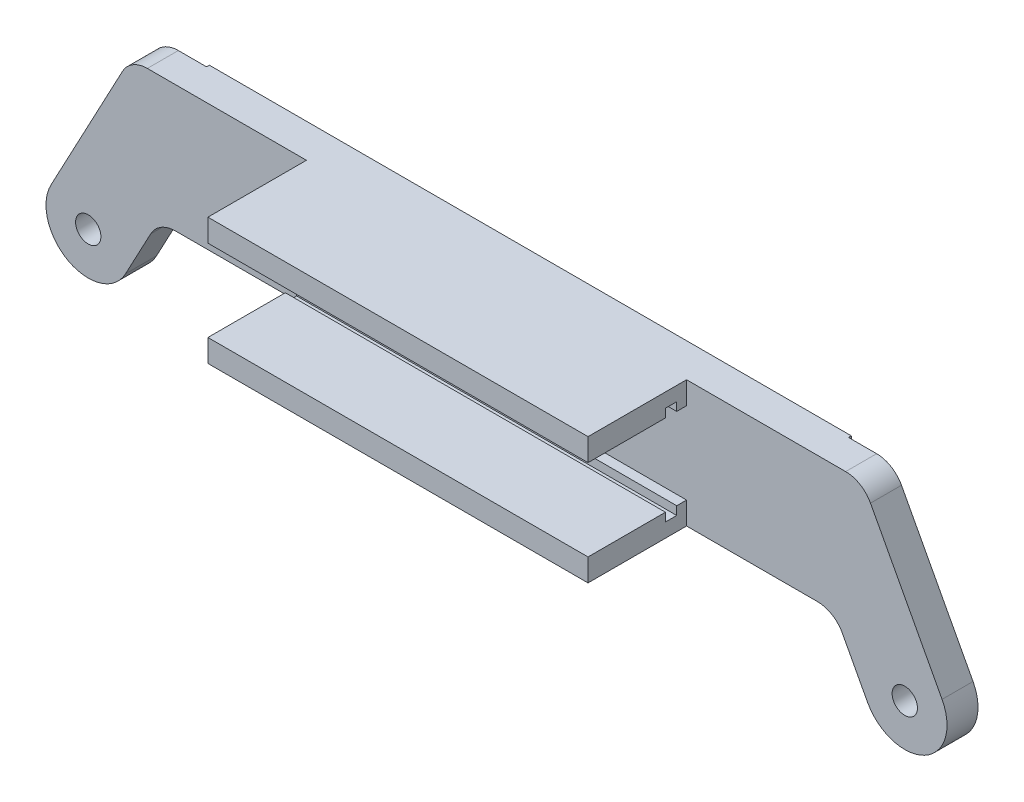
ISO-10303-21;
HEADER;
FILE_DESCRIPTION(('STEP AP214'),'2;1');
FILE_NAME('part.step','',(''),(''),'','','');
FILE_SCHEMA(('AUTOMOTIVE_DESIGN { 1 0 10303 214 1 1 1 1 }'));
ENDSEC;
DATA;
#1=APPLICATION_CONTEXT('core data for automotive mechanical design processes');
#2=APPLICATION_PROTOCOL_DEFINITION('international standard','automotive_design',2000,#1);
#3=PRODUCT_CONTEXT('',#1,'mechanical');
#4=PRODUCT('Part','Part','',(#3));
#5=PRODUCT_RELATED_PRODUCT_CATEGORY('part','',(#4));
#6=PRODUCT_DEFINITION_FORMATION('','',#4);
#7=PRODUCT_DEFINITION_CONTEXT('part definition',#1,'design');
#8=PRODUCT_DEFINITION('design','',#6,#7);
#9=PRODUCT_DEFINITION_SHAPE('','',#8);
#10=(LENGTH_UNIT() NAMED_UNIT(*) SI_UNIT(.MILLI.,.METRE.));
#11=(NAMED_UNIT(*) PLANE_ANGLE_UNIT() SI_UNIT($,.RADIAN.));
#12=(NAMED_UNIT(*) SI_UNIT($,.STERADIAN.) SOLID_ANGLE_UNIT());
#13=UNCERTAINTY_MEASURE_WITH_UNIT(LENGTH_MEASURE(1.E-05),#10,'distance_accuracy_value','');
#14=(GEOMETRIC_REPRESENTATION_CONTEXT(3) GLOBAL_UNCERTAINTY_ASSIGNED_CONTEXT((#13)) GLOBAL_UNIT_ASSIGNED_CONTEXT((#10,
#11,#12)) REPRESENTATION_CONTEXT('',''));
#15=CARTESIAN_POINT('',(0.,0.,0.));
#16=DIRECTION('',(0.,0.,1.));
#17=DIRECTION('',(1.,0.,0.));
#18=AXIS2_PLACEMENT_3D('',#15,#16,#17);
#19=CARTESIAN_POINT('',(0.,0.,-5.));
#20=DIRECTION('',(0.,0.,-1.));
#21=DIRECTION('',(-1.,0.,0.));
#22=AXIS2_PLACEMENT_3D('',#19,#20,#21);
#23=PLANE('',#22);
#24=DIRECTION('',(0.,-1.,0.));
#25=VECTOR('',#24,1.);
#26=CARTESIAN_POINT('',(114.,22.5,-5.));
#27=LINE('',#26,#25);
#28=CARTESIAN_POINT('',(114.,22.5,-5.));
#29=VERTEX_POINT('',#28);
#30=CARTESIAN_POINT('',(114.,-22.5,-5.));
#31=VERTEX_POINT('',#30);
#32=EDGE_CURVE('E60',#29,#31,#27,.T.);
#33=ORIENTED_EDGE('',*,*,#32,.F.);
#34=DIRECTION('',(1.,0.,0.));
#35=VECTOR('',#34,1.);
#36=CARTESIAN_POINT('',(-110.,22.5,-5.));
#37=LINE('',#36,#35);
#38=CARTESIAN_POINT('',(124.,22.5,-5.));
#39=VERTEX_POINT('',#38);
#40=EDGE_CURVE('E395',#29,#39,#37,.T.);
#41=ORIENTED_EDGE('',*,*,#40,.T.);
#42=CARTESIAN_POINT('',(124.,12.5,-5.));
#43=DIRECTION('',(0.,0.,-1.));
#44=DIRECTION('',(-1.,0.,0.));
#45=AXIS2_PLACEMENT_3D('',#42,#43,#44);
#46=CIRCLE('',#45,10.);
#47=CARTESIAN_POINT('',(132.823529411765,17.2058823529412,-5.));
#48=VERTEX_POINT('',#47);
#49=EDGE_CURVE('E457',#39,#48,#46,.T.);
#50=ORIENTED_EDGE('',*,*,#49,.T.);
#51=DIRECTION('',(0.470588235294117,-0.882352941176471,0.));
#52=VECTOR('',#51,1.);
#53=CARTESIAN_POINT('',(158.235294117647,-30.4411764705882,-5.));
#54=LINE('',#53,#52);
#55=CARTESIAN_POINT('',(158.235294117647,-30.4411764705882,-5.));
#56=VERTEX_POINT('',#55);
#57=EDGE_CURVE('E374',#48,#56,#54,.T.);
#58=ORIENTED_EDGE('',*,*,#57,.T.);
#59=CARTESIAN_POINT('',(145.,-37.5,-5.));
#60=DIRECTION('',(0.,0.,-1.));
#61=DIRECTION('',(-1.,0.,0.));
#62=AXIS2_PLACEMENT_3D('',#59,#60,#61);
#63=CIRCLE('',#62,15.);
#64=CARTESIAN_POINT('',(131.764705882353,-44.5588235294118,-5.));
#65=VERTEX_POINT('',#64);
#66=EDGE_CURVE('E388',#56,#65,#63,.T.);
#67=ORIENTED_EDGE('',*,*,#66,.T.);
#68=DIRECTION('',(-0.470588235294116,0.882352941176472,0.));
#69=VECTOR('',#68,1.);
#70=CARTESIAN_POINT('',(120.,-22.5,-5.));
#71=LINE('',#70,#69);
#72=CARTESIAN_POINT('',(122.823529411765,-27.7941176470588,-5.));
#73=VERTEX_POINT('',#72);
#74=EDGE_CURVE('E380',#65,#73,#71,.T.);
#75=ORIENTED_EDGE('',*,*,#74,.T.);
#76=CARTESIAN_POINT('',(114.,-32.5,-5.));
#77=DIRECTION('',(0.,0.,-1.));
#78=DIRECTION('',(-1.,0.,0.));
#79=AXIS2_PLACEMENT_3D('',#76,#77,#78);
#80=CIRCLE('',#79,10.);
#81=EDGE_CURVE('E479',#73,#31,#80,.F.);
#82=ORIENTED_EDGE('',*,*,#81,.T.);
#83=EDGE_LOOP('',(#33,#41,#50,#58,#67,#75,#82));
#84=FACE_BOUND('',#83,.T.);
#85=CARTESIAN_POINT('',(145.,-37.5,-5.));
#86=DIRECTION('',(0.,0.,1.));
#87=DIRECTION('',(1.,0.,0.));
#88=AXIS2_PLACEMENT_3D('',#85,#86,#87);
#89=CIRCLE('',#88,4.49999999999999);
#90=CARTESIAN_POINT('',(149.5,-37.5,-5.));
#91=VERTEX_POINT('',#90);
#92=EDGE_CURVE('E371',#91,#91,#89,.T.);
#93=ORIENTED_EDGE('',*,*,#92,.T.);
#94=EDGE_LOOP('',(#93));
#95=FACE_BOUND('',#94,.T.);
#96=ADVANCED_FACE('F45',(#84,#95),#23,.T.);
#97=CARTESIAN_POINT('',(-75.,-14.5,41.));
#98=DIRECTION('',(0.,-1.,0.));
#99=DIRECTION('',(0.,0.,-1.));
#100=AXIS2_PLACEMENT_3D('',#97,#98,#99);
#101=PLANE('',#100);
#102=DIRECTION('',(-1.,0.,0.));
#103=VECTOR('',#102,1.);
#104=CARTESIAN_POINT('',(-75.,-14.5,13.5));
#105=LINE('',#104,#103);
#106=CARTESIAN_POINT('',(67.5,-14.5,13.5));
#107=VERTEX_POINT('',#106);
#108=CARTESIAN_POINT('',(-67.5,-14.5,13.5));
#109=VERTEX_POINT('',#108);
#110=EDGE_CURVE('E445',#107,#109,#105,.T.);
#111=ORIENTED_EDGE('',*,*,#110,.T.);
#112=DIRECTION('',(0.,0.,1.));
#113=VECTOR('',#112,1.);
#114=CARTESIAN_POINT('',(-67.5,-14.5,6.));
#115=LINE('',#114,#113);
#116=CARTESIAN_POINT('',(-67.5,-14.5,41.));
#117=VERTEX_POINT('',#116);
#118=EDGE_CURVE('E272',#109,#117,#115,.T.);
#119=ORIENTED_EDGE('',*,*,#118,.T.);
#120=DIRECTION('',(-1.,0.,0.));
#121=VECTOR('',#120,1.);
#122=CARTESIAN_POINT('',(-77.5,-14.5,41.));
#123=LINE('',#122,#121);
#124=CARTESIAN_POINT('',(67.5,-14.5,41.));
#125=VERTEX_POINT('',#124);
#126=EDGE_CURVE('E432',#125,#117,#123,.T.);
#127=ORIENTED_EDGE('',*,*,#126,.F.);
#128=DIRECTION('',(0.,0.,1.));
#129=VECTOR('',#128,1.);
#130=CARTESIAN_POINT('',(67.5,-14.5,6.));
#131=LINE('',#130,#129);
#132=EDGE_CURVE('E296',#107,#125,#131,.T.);
#133=ORIENTED_EDGE('',*,*,#132,.F.);
#134=EDGE_LOOP('',(#111,#119,#127,#133));
#135=FACE_BOUND('',#134,.T.);
#136=ADVANCED_FACE('F560',(#135),#101,.F.);
#137=CARTESIAN_POINT('',(77.5,14.5,41.));
#138=DIRECTION('',(0.,1.,0.));
#139=DIRECTION('',(0.,0.,1.));
#140=AXIS2_PLACEMENT_3D('',#137,#138,#139);
#141=PLANE('',#140);
#142=DIRECTION('',(1.,0.,0.));
#143=VECTOR('',#142,1.);
#144=CARTESIAN_POINT('',(77.5,14.5,6.));
#145=LINE('',#144,#143);
#146=CARTESIAN_POINT('',(-67.5,14.5,6.));
#147=VERTEX_POINT('',#146);
#148=CARTESIAN_POINT('',(67.5,14.5,6.));
#149=VERTEX_POINT('',#148);
#150=EDGE_CURVE('E423',#147,#149,#145,.T.);
#151=ORIENTED_EDGE('',*,*,#150,.T.);
#152=DIRECTION('',(0.,0.,1.));
#153=VECTOR('',#152,1.);
#154=CARTESIAN_POINT('',(67.5,14.5,6.));
#155=LINE('',#154,#153);
#156=CARTESIAN_POINT('',(67.5,14.5,9.5));
#157=VERTEX_POINT('',#156);
#158=EDGE_CURVE('E284',#149,#157,#155,.T.);
#159=ORIENTED_EDGE('',*,*,#158,.T.);
#160=DIRECTION('',(-1.,0.,0.));
#161=VECTOR('',#160,1.);
#162=CARTESIAN_POINT('',(110.,14.5,9.5));
#163=LINE('',#162,#161);
#164=CARTESIAN_POINT('',(-67.5,14.5,9.5));
#165=VERTEX_POINT('',#164);
#166=EDGE_CURVE('E411',#157,#165,#163,.T.);
#167=ORIENTED_EDGE('',*,*,#166,.T.);
#168=DIRECTION('',(0.,0.,1.));
#169=VECTOR('',#168,1.);
#170=CARTESIAN_POINT('',(-67.5,14.5,6.));
#171=LINE('',#170,#169);
#172=EDGE_CURVE('E321',#147,#165,#171,.T.);
#173=ORIENTED_EDGE('',*,*,#172,.F.);
#174=EDGE_LOOP('',(#151,#159,#167,#173));
#175=FACE_BOUND('',#174,.T.);
#176=ADVANCED_FACE('F503',(#175),#141,.F.);
#177=CARTESIAN_POINT('',(110.,-22.5,6.));
#178=DIRECTION('',(0.,1.,0.));
#179=DIRECTION('',(-1.,0.,0.));
#180=AXIS2_PLACEMENT_3D('',#177,#178,#179);
#181=PLANE('',#180);
#182=DIRECTION('',(1.,0.,0.));
#183=VECTOR('',#182,1.);
#184=CARTESIAN_POINT('',(-77.5,-22.5,41.));
#185=LINE('',#184,#183);
#186=CARTESIAN_POINT('',(-67.5,-22.5,41.));
#187=VERTEX_POINT('',#186);
#188=CARTESIAN_POINT('',(67.5,-22.5,41.));
#189=VERTEX_POINT('',#188);
#190=EDGE_CURVE('E404',#187,#189,#185,.T.);
#191=ORIENTED_EDGE('',*,*,#190,.F.);
#192=DIRECTION('',(0.,0.,1.));
#193=VECTOR('',#192,1.);
#194=CARTESIAN_POINT('',(-67.5,-22.5,6.));
#195=LINE('',#194,#193);
#196=CARTESIAN_POINT('',(-67.5,-22.5,6.));
#197=VERTEX_POINT('',#196);
#198=EDGE_CURVE('E305',#197,#187,#195,.T.);
#199=ORIENTED_EDGE('',*,*,#198,.F.);
#200=DIRECTION('',(1.,0.,0.));
#201=VECTOR('',#200,1.);
#202=CARTESIAN_POINT('',(110.,-22.5,6.));
#203=LINE('',#202,#201);
#204=CARTESIAN_POINT('',(-114.,-22.5,6.));
#205=VERTEX_POINT('',#204);
#206=EDGE_CURVE('E437',#205,#197,#203,.T.);
#207=ORIENTED_EDGE('',*,*,#206,.F.);
#208=DIRECTION('',(0.,0.,-1.));
#209=VECTOR('',#208,1.);
#210=CARTESIAN_POINT('',(-114.,-22.5,-5.));
#211=LINE('',#210,#209);
#212=CARTESIAN_POINT('',(-114.,-22.5,-5.));
#213=VERTEX_POINT('',#212);
#214=EDGE_CURVE('E450',#205,#213,#211,.T.);
#215=ORIENTED_EDGE('',*,*,#214,.T.);
#216=DIRECTION('',(0.,0.,1.));
#217=VECTOR('',#216,1.);
#218=CARTESIAN_POINT('',(-114.,-22.5,-6.));
#219=LINE('',#218,#217);
#220=CARTESIAN_POINT('',(-114.,-22.5,-6.));
#221=VERTEX_POINT('',#220);
#222=EDGE_CURVE('E256',#221,#213,#219,.T.);
#223=ORIENTED_EDGE('',*,*,#222,.F.);
#224=DIRECTION('',(-1.,0.,0.));
#225=VECTOR('',#224,1.);
#226=CARTESIAN_POINT('',(114.,-22.5,-6.));
#227=LINE('',#226,#225);
#228=CARTESIAN_POINT('',(114.,-22.5,-6.));
#229=VERTEX_POINT('',#228);
#230=EDGE_CURVE('E248',#229,#221,#227,.T.);
#231=ORIENTED_EDGE('',*,*,#230,.F.);
#232=DIRECTION('',(0.,0.,1.));
#233=VECTOR('',#232,1.);
#234=CARTESIAN_POINT('',(114.,-22.5,-6.));
#235=LINE('',#234,#233);
#236=EDGE_CURVE('E253',#229,#31,#235,.T.);
#237=ORIENTED_EDGE('',*,*,#236,.T.);
#238=DIRECTION('',(0.,0.,-1.));
#239=VECTOR('',#238,1.);
#240=CARTESIAN_POINT('',(114.,-22.5,6.));
#241=LINE('',#240,#239);
#242=CARTESIAN_POINT('',(114.,-22.5,6.));
#243=VERTEX_POINT('',#242);
#244=EDGE_CURVE('E448',#31,#243,#241,.F.);
#245=ORIENTED_EDGE('',*,*,#244,.T.);
#246=CARTESIAN_POINT('',(67.5,-22.5,6.));
#247=VERTEX_POINT('',#246);
#248=EDGE_CURVE('E426',#247,#243,#203,.T.);
#249=ORIENTED_EDGE('',*,*,#248,.F.);
#250=DIRECTION('',(0.,0.,1.));
#251=VECTOR('',#250,1.);
#252=CARTESIAN_POINT('',(67.5,-22.5,6.));
#253=LINE('',#252,#251);
#254=EDGE_CURVE('E297',#247,#189,#253,.T.);
#255=ORIENTED_EDGE('',*,*,#254,.T.);
#256=EDGE_LOOP('',(#191,#199,#207,#215,#223,#231,#237,#245,#249,#255));
#257=FACE_BOUND('',#256,.T.);
#258=ADVANCED_FACE('F251',(#257),#181,.F.);
#259=CARTESIAN_POINT('',(110.,22.5,6.));
#260=DIRECTION('',(0.,-1.,0.));
#261=DIRECTION('',(1.,0.,0.));
#262=AXIS2_PLACEMENT_3D('',#259,#260,#261);
#263=PLANE('',#262);
#264=DIRECTION('',(-1.,0.,0.));
#265=VECTOR('',#264,1.);
#266=CARTESIAN_POINT('',(-77.5,22.5,41.));
#267=LINE('',#266,#265);
#268=CARTESIAN_POINT('',(67.5,22.5,41.));
#269=VERTEX_POINT('',#268);
#270=CARTESIAN_POINT('',(-67.5,22.5,41.));
#271=VERTEX_POINT('',#270);
#272=EDGE_CURVE('E422',#269,#271,#267,.T.);
#273=ORIENTED_EDGE('',*,*,#272,.F.);
#274=DIRECTION('',(0.,0.,1.));
#275=VECTOR('',#274,1.);
#276=CARTESIAN_POINT('',(67.5,22.5,6.));
#277=LINE('',#276,#275);
#278=CARTESIAN_POINT('',(67.5,22.5,6.));
#279=VERTEX_POINT('',#278);
#280=EDGE_CURVE('E281',#279,#269,#277,.T.);
#281=ORIENTED_EDGE('',*,*,#280,.F.);
#282=DIRECTION('',(-1.,0.,0.));
#283=VECTOR('',#282,1.);
#284=CARTESIAN_POINT('',(110.,22.5,6.));
#285=LINE('',#284,#283);
#286=CARTESIAN_POINT('',(124.,22.5,6.));
#287=VERTEX_POINT('',#286);
#288=EDGE_CURVE('E440',#287,#279,#285,.T.);
#289=ORIENTED_EDGE('',*,*,#288,.F.);
#290=DIRECTION('',(0.,0.,-1.));
#291=VECTOR('',#290,1.);
#292=CARTESIAN_POINT('',(124.,22.5,-5.));
#293=LINE('',#292,#291);
#294=EDGE_CURVE('E461',#287,#39,#293,.T.);
#295=ORIENTED_EDGE('',*,*,#294,.T.);
#296=ORIENTED_EDGE('',*,*,#40,.F.);
#297=DIRECTION('',(0.,0.,1.));
#298=VECTOR('',#297,1.);
#299=CARTESIAN_POINT('',(114.,22.5,-6.));
#300=LINE('',#299,#298);
#301=CARTESIAN_POINT('',(114.,22.5,-6.));
#302=VERTEX_POINT('',#301);
#303=EDGE_CURVE('E582',#302,#29,#300,.T.);
#304=ORIENTED_EDGE('',*,*,#303,.F.);
#305=DIRECTION('',(1.,0.,0.));
#306=VECTOR('',#305,1.);
#307=CARTESIAN_POINT('',(114.,22.5,-6.));
#308=LINE('',#307,#306);
#309=CARTESIAN_POINT('',(-114.,22.5,-6.));
#310=VERTEX_POINT('',#309);
#311=EDGE_CURVE('E265',#310,#302,#308,.T.);
#312=ORIENTED_EDGE('',*,*,#311,.F.);
#313=DIRECTION('',(0.,0.,1.));
#314=VECTOR('',#313,1.);
#315=CARTESIAN_POINT('',(-114.,22.5,-6.));
#316=LINE('',#315,#314);
#317=CARTESIAN_POINT('',(-114.,22.5,-5.));
#318=VERTEX_POINT('',#317);
#319=EDGE_CURVE('E277',#310,#318,#316,.T.);
#320=ORIENTED_EDGE('',*,*,#319,.T.);
#321=CARTESIAN_POINT('',(-124.,22.5,-5.));
#322=VERTEX_POINT('',#321);
#323=EDGE_CURVE('E398',#322,#318,#37,.T.);
#324=ORIENTED_EDGE('',*,*,#323,.F.);
#325=DIRECTION('',(0.,0.,-1.));
#326=VECTOR('',#325,1.);
#327=CARTESIAN_POINT('',(-124.,22.5,6.));
#328=LINE('',#327,#326);
#329=CARTESIAN_POINT('',(-124.,22.5,6.));
#330=VERTEX_POINT('',#329);
#331=EDGE_CURVE('E464',#322,#330,#328,.F.);
#332=ORIENTED_EDGE('',*,*,#331,.T.);
#333=CARTESIAN_POINT('',(-67.5,22.5,6.));
#334=VERTEX_POINT('',#333);
#335=EDGE_CURVE('E439',#334,#330,#285,.T.);
#336=ORIENTED_EDGE('',*,*,#335,.F.);
#337=DIRECTION('',(0.,0.,1.));
#338=VECTOR('',#337,1.);
#339=CARTESIAN_POINT('',(-67.5,22.5,6.));
#340=LINE('',#339,#338);
#341=EDGE_CURVE('E317',#334,#271,#340,.T.);
#342=ORIENTED_EDGE('',*,*,#341,.T.);
#343=EDGE_LOOP('',(#273,#281,#289,#295,#296,#304,#312,#320,#324,#332,#336,#342));
#344=FACE_BOUND('',#343,.T.);
#345=ADVANCED_FACE('F516',(#344),#263,.F.);
#346=CARTESIAN_POINT('',(0.,0.,6.));
#347=DIRECTION('',(0.,0.,1.));
#348=DIRECTION('',(1.,0.,0.));
#349=AXIS2_PLACEMENT_3D('',#346,#347,#348);
#350=PLANE('',#349);
#351=ORIENTED_EDGE('',*,*,#150,.F.);
#352=DIRECTION('',(0.,1.,0.));
#353=VECTOR('',#352,1.);
#354=CARTESIAN_POINT('',(-67.5,14.5,6.));
#355=LINE('',#354,#353);
#356=EDGE_CURVE('E312',#147,#334,#355,.T.);
#357=ORIENTED_EDGE('',*,*,#356,.T.);
#358=ORIENTED_EDGE('',*,*,#335,.T.);
#359=CARTESIAN_POINT('',(-124.,12.5,6.));
#360=DIRECTION('',(0.,0.,1.));
#361=DIRECTION('',(1.,0.,0.));
#362=AXIS2_PLACEMENT_3D('',#359,#360,#361);
#363=CIRCLE('',#362,10.);
#364=CARTESIAN_POINT('',(-132.823529411765,17.2058823529411,6.));
#365=VERTEX_POINT('',#364);
#366=EDGE_CURVE('E468',#330,#365,#363,.T.);
#367=ORIENTED_EDGE('',*,*,#366,.T.);
#368=DIRECTION('',(-0.470588235294117,-0.882352941176471,0.));
#369=VECTOR('',#368,1.);
#370=CARTESIAN_POINT('',(-158.235294117647,-30.4411764705882,6.));
#371=LINE('',#370,#369);
#372=CARTESIAN_POINT('',(-158.235294117647,-30.4411764705882,6.));
#373=VERTEX_POINT('',#372);
#374=EDGE_CURVE('E357',#365,#373,#371,.T.);
#375=ORIENTED_EDGE('',*,*,#374,.T.);
#376=CARTESIAN_POINT('',(-145.,-37.5,6.));
#377=DIRECTION('',(0.,0.,1.));
#378=DIRECTION('',(1.,0.,0.));
#379=AXIS2_PLACEMENT_3D('',#376,#377,#378);
#380=CIRCLE('',#379,15.);
#381=CARTESIAN_POINT('',(-131.764705882353,-44.5588235294118,6.));
#382=VERTEX_POINT('',#381);
#383=EDGE_CURVE('E354',#373,#382,#380,.T.);
#384=ORIENTED_EDGE('',*,*,#383,.T.);
#385=DIRECTION('',(0.470588235294116,0.882352941176472,0.));
#386=VECTOR('',#385,1.);
#387=CARTESIAN_POINT('',(-120.,-22.5,6.));
#388=LINE('',#387,#386);
#389=CARTESIAN_POINT('',(-122.823529411765,-27.7941176470589,6.));
#390=VERTEX_POINT('',#389);
#391=EDGE_CURVE('E351',#382,#390,#388,.T.);
#392=ORIENTED_EDGE('',*,*,#391,.T.);
#393=CARTESIAN_POINT('',(-114.,-32.5,6.));
#394=DIRECTION('',(0.,0.,1.));
#395=DIRECTION('',(1.,0.,0.));
#396=AXIS2_PLACEMENT_3D('',#393,#394,#395);
#397=CIRCLE('',#396,10.);
#398=EDGE_CURVE('E477',#390,#205,#397,.F.);
#399=ORIENTED_EDGE('',*,*,#398,.T.);
#400=ORIENTED_EDGE('',*,*,#206,.T.);
#401=DIRECTION('',(0.,1.,0.));
#402=VECTOR('',#401,1.);
#403=CARTESIAN_POINT('',(-67.5,-14.5,6.));
#404=LINE('',#403,#402);
#405=CARTESIAN_POINT('',(-67.5,-14.5,6.));
#406=VERTEX_POINT('',#405);
#407=EDGE_CURVE('E306',#197,#406,#404,.T.);
#408=ORIENTED_EDGE('',*,*,#407,.T.);
#409=DIRECTION('',(-1.,0.,0.));
#410=VECTOR('',#409,1.);
#411=CARTESIAN_POINT('',(-75.,-14.5,6.));
#412=LINE('',#411,#410);
#413=CARTESIAN_POINT('',(67.5,-14.5,6.));
#414=VERTEX_POINT('',#413);
#415=EDGE_CURVE('E429',#414,#406,#412,.T.);
#416=ORIENTED_EDGE('',*,*,#415,.F.);
#417=DIRECTION('',(0.,-1.,0.));
#418=VECTOR('',#417,1.);
#419=CARTESIAN_POINT('',(67.5,-14.5,6.));
#420=LINE('',#419,#418);
#421=EDGE_CURVE('E295',#414,#247,#420,.T.);
#422=ORIENTED_EDGE('',*,*,#421,.T.);
#423=ORIENTED_EDGE('',*,*,#248,.T.);
#424=CARTESIAN_POINT('',(114.,-32.5,6.));
#425=DIRECTION('',(0.,0.,1.));
#426=DIRECTION('',(1.,0.,0.));
#427=AXIS2_PLACEMENT_3D('',#424,#425,#426);
#428=CIRCLE('',#427,10.);
#429=CARTESIAN_POINT('',(122.823529411765,-27.7941176470588,6.));
#430=VERTEX_POINT('',#429);
#431=EDGE_CURVE('E481',#243,#430,#428,.F.);
#432=ORIENTED_EDGE('',*,*,#431,.T.);
#433=DIRECTION('',(-0.470588235294116,0.882352941176472,0.));
#434=VECTOR('',#433,1.);
#435=CARTESIAN_POINT('',(120.,-22.5,6.));
#436=LINE('',#435,#434);
#437=CARTESIAN_POINT('',(131.764705882353,-44.5588235294118,6.));
#438=VERTEX_POINT('',#437);
#439=EDGE_CURVE('E383',#438,#430,#436,.T.);
#440=ORIENTED_EDGE('',*,*,#439,.F.);
#441=CARTESIAN_POINT('',(145.,-37.5,6.));
#442=DIRECTION('',(0.,0.,-1.));
#443=DIRECTION('',(-1.,0.,0.));
#444=AXIS2_PLACEMENT_3D('',#441,#442,#443);
#445=CIRCLE('',#444,15.);
#446=CARTESIAN_POINT('',(158.235294117647,-30.4411764705882,6.));
#447=VERTEX_POINT('',#446);
#448=EDGE_CURVE('E379',#447,#438,#445,.T.);
#449=ORIENTED_EDGE('',*,*,#448,.F.);
#450=DIRECTION('',(0.470588235294117,-0.882352941176471,0.));
#451=VECTOR('',#450,1.);
#452=CARTESIAN_POINT('',(158.235294117647,-30.4411764705882,6.));
#453=LINE('',#452,#451);
#454=CARTESIAN_POINT('',(132.823529411765,17.2058823529412,6.));
#455=VERTEX_POINT('',#454);
#456=EDGE_CURVE('E377',#455,#447,#453,.T.);
#457=ORIENTED_EDGE('',*,*,#456,.F.);
#458=CARTESIAN_POINT('',(124.,12.5,6.));
#459=DIRECTION('',(0.,0.,1.));
#460=DIRECTION('',(1.,0.,0.));
#461=AXIS2_PLACEMENT_3D('',#458,#459,#460);
#462=CIRCLE('',#461,10.);
#463=EDGE_CURVE('E466',#455,#287,#462,.T.);
#464=ORIENTED_EDGE('',*,*,#463,.T.);
#465=ORIENTED_EDGE('',*,*,#288,.T.);
#466=DIRECTION('',(0.,-1.,0.));
#467=VECTOR('',#466,1.);
#468=CARTESIAN_POINT('',(67.5,14.5,6.));
#469=LINE('',#468,#467);
#470=EDGE_CURVE('E283',#279,#149,#469,.T.);
#471=ORIENTED_EDGE('',*,*,#470,.T.);
#472=EDGE_LOOP('',(#351,#357,#358,#367,#375,#384,#392,#399,#400,#408,#416,#422,#423,#432,#440,
#449,#457,#464,#465,#471));
#473=FACE_BOUND('',#472,.T.);
#474=CARTESIAN_POINT('',(-145.,-37.5,6.));
#475=DIRECTION('',(0.,0.,-1.));
#476=DIRECTION('',(-1.,0.,0.));
#477=AXIS2_PLACEMENT_3D('',#474,#475,#476);
#478=CIRCLE('',#477,4.49999999999999);
#479=CARTESIAN_POINT('',(-149.5,-37.5,6.));
#480=VERTEX_POINT('',#479);
#481=EDGE_CURVE('E344',#480,#480,#478,.T.);
#482=ORIENTED_EDGE('',*,*,#481,.T.);
#483=EDGE_LOOP('',(#482));
#484=FACE_BOUND('',#483,.T.);
#485=CARTESIAN_POINT('',(145.,-37.5,6.));
#486=DIRECTION('',(0.,0.,1.));
#487=DIRECTION('',(1.,0.,0.));
#488=AXIS2_PLACEMENT_3D('',#485,#486,#487);
#489=CIRCLE('',#488,4.49999999999999);
#490=CARTESIAN_POINT('',(149.5,-37.5,6.));
#491=VERTEX_POINT('',#490);
#492=EDGE_CURVE('E368',#491,#491,#489,.T.);
#493=ORIENTED_EDGE('',*,*,#492,.F.);
#494=EDGE_LOOP('',(#493));
#495=FACE_BOUND('',#494,.T.);
#496=ADVANCED_FACE('F508',(#473,#484,#495),#350,.T.);
#497=ORIENTED_EDGE('',*,*,#415,.T.);
#498=CARTESIAN_POINT('',(-67.5,-14.5,9.50000000000002));
#499=VERTEX_POINT('',#498);
#500=EDGE_CURVE('E275',#406,#499,#115,.T.);
#501=ORIENTED_EDGE('',*,*,#500,.T.);
#502=DIRECTION('',(1.,0.,0.));
#503=VECTOR('',#502,1.);
#504=CARTESIAN_POINT('',(-75.,-14.5,9.50000000000002));
#505=LINE('',#504,#503);
#506=CARTESIAN_POINT('',(67.5,-14.5,9.50000000000002));
#507=VERTEX_POINT('',#506);
#508=EDGE_CURVE('E442',#499,#507,#505,.T.);
#509=ORIENTED_EDGE('',*,*,#508,.T.);
#510=EDGE_CURVE('E293',#414,#507,#131,.T.);
#511=ORIENTED_EDGE('',*,*,#510,.F.);
#512=EDGE_LOOP('',(#497,#501,#509,#511));
#513=FACE_BOUND('',#512,.T.);
#514=ADVANCED_FACE('F545',(#513),#101,.F.);
#515=CARTESIAN_POINT('',(0.,0.,41.));
#516=DIRECTION('',(0.,0.,1.));
#517=DIRECTION('',(1.,0.,0.));
#518=AXIS2_PLACEMENT_3D('',#515,#516,#517);
#519=PLANE('',#518);
#520=DIRECTION('',(0.,1.,0.));
#521=VECTOR('',#520,1.);
#522=CARTESIAN_POINT('',(-67.5,-14.5,41.));
#523=LINE('',#522,#521);
#524=EDGE_CURVE('E300',#187,#117,#523,.T.);
#525=ORIENTED_EDGE('',*,*,#524,.F.);
#526=ORIENTED_EDGE('',*,*,#190,.T.);
#527=DIRECTION('',(0.,-1.,0.));
#528=VECTOR('',#527,1.);
#529=CARTESIAN_POINT('',(67.5,-14.5,41.));
#530=LINE('',#529,#528);
#531=EDGE_CURVE('E301',#125,#189,#530,.T.);
#532=ORIENTED_EDGE('',*,*,#531,.F.);
#533=ORIENTED_EDGE('',*,*,#126,.T.);
#534=EDGE_LOOP('',(#525,#526,#532,#533));
#535=FACE_BOUND('',#534,.T.);
#536=ADVANCED_FACE('F563',(#535),#519,.T.);
#537=DIRECTION('',(-1.,0.,0.));
#538=VECTOR('',#537,1.);
#539=CARTESIAN_POINT('',(110.,14.5,13.5));
#540=LINE('',#539,#538);
#541=CARTESIAN_POINT('',(67.5,14.5,13.5));
#542=VERTEX_POINT('',#541);
#543=CARTESIAN_POINT('',(-67.5,14.5,13.5));
#544=VERTEX_POINT('',#543);
#545=EDGE_CURVE('E408',#542,#544,#540,.T.);
#546=ORIENTED_EDGE('',*,*,#545,.F.);
#547=CARTESIAN_POINT('',(67.5,14.5,41.));
#548=VERTEX_POINT('',#547);
#549=EDGE_CURVE('E287',#542,#548,#155,.T.);
#550=ORIENTED_EDGE('',*,*,#549,.T.);
#551=DIRECTION('',(1.,0.,0.));
#552=VECTOR('',#551,1.);
#553=CARTESIAN_POINT('',(-77.5,14.5,41.));
#554=LINE('',#553,#552);
#555=CARTESIAN_POINT('',(-67.5,14.5,41.));
#556=VERTEX_POINT('',#555);
#557=EDGE_CURVE('E419',#556,#548,#554,.T.);
#558=ORIENTED_EDGE('',*,*,#557,.F.);
#559=EDGE_CURVE('E315',#544,#556,#171,.T.);
#560=ORIENTED_EDGE('',*,*,#559,.F.);
#561=EDGE_LOOP('',(#546,#550,#558,#560));
#562=FACE_BOUND('',#561,.T.);
#563=ADVANCED_FACE('F663',(#562),#141,.F.);
#564=CARTESIAN_POINT('',(0.,0.,41.));
#565=DIRECTION('',(0.,0.,-1.));
#566=DIRECTION('',(-1.,0.,0.));
#567=AXIS2_PLACEMENT_3D('',#564,#565,#566);
#568=PLANE('',#567);
#569=ORIENTED_EDGE('',*,*,#557,.T.);
#570=DIRECTION('',(0.,-1.,0.));
#571=VECTOR('',#570,1.);
#572=CARTESIAN_POINT('',(67.5,14.5,41.));
#573=LINE('',#572,#571);
#574=EDGE_CURVE('E288',#269,#548,#573,.T.);
#575=ORIENTED_EDGE('',*,*,#574,.F.);
#576=ORIENTED_EDGE('',*,*,#272,.T.);
#577=DIRECTION('',(0.,1.,0.));
#578=VECTOR('',#577,1.);
#579=CARTESIAN_POINT('',(-67.5,14.5,41.));
#580=LINE('',#579,#578);
#581=EDGE_CURVE('E290',#556,#271,#580,.T.);
#582=ORIENTED_EDGE('',*,*,#581,.F.);
#583=EDGE_LOOP('',(#569,#575,#576,#582));
#584=FACE_BOUND('',#583,.T.);
#585=ADVANCED_FACE('F654',(#584),#568,.F.);
#586=CARTESIAN_POINT('',(110.,14.5,9.5));
#587=DIRECTION('',(0.,0.,-1.));
#588=DIRECTION('',(0.,1.,0.));
#589=AXIS2_PLACEMENT_3D('',#586,#587,#588);
#590=PLANE('',#589);
#591=ORIENTED_EDGE('',*,*,#166,.F.);
#592=DIRECTION('',(0.,1.,0.));
#593=VECTOR('',#592,1.);
#594=CARTESIAN_POINT('',(67.5,14.4999999999999,9.5));
#595=LINE('',#594,#593);
#596=CARTESIAN_POINT('',(67.5,17.5,9.5));
#597=VERTEX_POINT('',#596);
#598=EDGE_CURVE('E341',#157,#597,#595,.T.);
#599=ORIENTED_EDGE('',*,*,#598,.T.);
#600=DIRECTION('',(-1.,0.,0.));
#601=VECTOR('',#600,1.);
#602=CARTESIAN_POINT('',(110.,17.5,9.5));
#603=LINE('',#602,#601);
#604=CARTESIAN_POINT('',(-67.5,17.5,9.5));
#605=VERTEX_POINT('',#604);
#606=EDGE_CURVE('E401',#597,#605,#603,.T.);
#607=ORIENTED_EDGE('',*,*,#606,.T.);
#608=DIRECTION('',(0.,-1.,0.));
#609=VECTOR('',#608,1.);
#610=CARTESIAN_POINT('',(-67.5,14.5000000000003,9.5));
#611=LINE('',#610,#609);
#612=EDGE_CURVE('E335',#605,#165,#611,.T.);
#613=ORIENTED_EDGE('',*,*,#612,.T.);
#614=EDGE_LOOP('',(#591,#599,#607,#613));
#615=FACE_BOUND('',#614,.T.);
#616=ADVANCED_FACE('F500',(#615),#590,.F.);
#617=CARTESIAN_POINT('',(110.,17.5,9.5));
#618=DIRECTION('',(0.,1.,0.));
#619=DIRECTION('',(0.,0.,1.));
#620=AXIS2_PLACEMENT_3D('',#617,#618,#619);
#621=PLANE('',#620);
#622=ORIENTED_EDGE('',*,*,#606,.F.);
#623=DIRECTION('',(0.,0.,1.));
#624=VECTOR('',#623,1.);
#625=CARTESIAN_POINT('',(67.5,17.5,9.5));
#626=LINE('',#625,#624);
#627=CARTESIAN_POINT('',(67.5,17.5,13.5));
#628=VERTEX_POINT('',#627);
#629=EDGE_CURVE('E338',#597,#628,#626,.T.);
#630=ORIENTED_EDGE('',*,*,#629,.T.);
#631=DIRECTION('',(-1.,0.,0.));
#632=VECTOR('',#631,1.);
#633=CARTESIAN_POINT('',(110.,17.5,13.5));
#634=LINE('',#633,#632);
#635=CARTESIAN_POINT('',(-67.5,17.5,13.5));
#636=VERTEX_POINT('',#635);
#637=EDGE_CURVE('E405',#628,#636,#634,.T.);
#638=ORIENTED_EDGE('',*,*,#637,.T.);
#639=DIRECTION('',(0.,0.,-1.));
#640=VECTOR('',#639,1.);
#641=CARTESIAN_POINT('',(-67.5,17.5,9.5));
#642=LINE('',#641,#640);
#643=EDGE_CURVE('E68',#636,#605,#642,.T.);
#644=ORIENTED_EDGE('',*,*,#643,.T.);
#645=EDGE_LOOP('',(#622,#630,#638,#644));
#646=FACE_BOUND('',#645,.T.);
#647=ADVANCED_FACE('F495',(#646),#621,.F.);
#648=CARTESIAN_POINT('',(110.,17.5,13.5));
#649=DIRECTION('',(0.,0.,1.));
#650=DIRECTION('',(0.,-1.,0.));
#651=AXIS2_PLACEMENT_3D('',#648,#649,#650);
#652=PLANE('',#651);
#653=ORIENTED_EDGE('',*,*,#637,.F.);
#654=DIRECTION('',(0.,-1.,0.));
#655=VECTOR('',#654,1.);
#656=CARTESIAN_POINT('',(67.5,17.4999999999999,13.5));
#657=LINE('',#656,#655);
#658=EDGE_CURVE('E11',#628,#542,#657,.T.);
#659=ORIENTED_EDGE('',*,*,#658,.T.);
#660=ORIENTED_EDGE('',*,*,#545,.T.);
#661=DIRECTION('',(0.,1.,0.));
#662=VECTOR('',#661,1.);
#663=CARTESIAN_POINT('',(-67.5,17.5000000000003,13.5));
#664=LINE('',#663,#662);
#665=EDGE_CURVE('E53',#544,#636,#664,.T.);
#666=ORIENTED_EDGE('',*,*,#665,.T.);
#667=EDGE_LOOP('',(#653,#659,#660,#666));
#668=FACE_BOUND('',#667,.T.);
#669=ADVANCED_FACE('F490',(#668),#652,.F.);
#670=CARTESIAN_POINT('',(110.,-17.5,9.50000000000002));
#671=DIRECTION('',(0.,-1.,0.));
#672=DIRECTION('',(0.,0.,-1.));
#673=AXIS2_PLACEMENT_3D('',#670,#671,#672);
#674=PLANE('',#673);
#675=DIRECTION('',(-1.,0.,0.));
#676=VECTOR('',#675,1.);
#677=CARTESIAN_POINT('',(110.,-17.5,9.50000000000002));
#678=LINE('',#677,#676);
#679=CARTESIAN_POINT('',(67.5,-17.5,9.50000000000002));
#680=VERTEX_POINT('',#679);
#681=CARTESIAN_POINT('',(-67.5,-17.5,9.50000000000002));
#682=VERTEX_POINT('',#681);
#683=EDGE_CURVE('E414',#680,#682,#678,.T.);
#684=ORIENTED_EDGE('',*,*,#683,.T.);
#685=DIRECTION('',(0.,0.,1.));
#686=VECTOR('',#685,1.);
#687=CARTESIAN_POINT('',(-67.5,-17.5,9.50000000000002));
#688=LINE('',#687,#686);
#689=CARTESIAN_POINT('',(-67.5,-17.5,13.5));
#690=VERTEX_POINT('',#689);
#691=EDGE_CURVE('E328',#682,#690,#688,.T.);
#692=ORIENTED_EDGE('',*,*,#691,.T.);
#693=DIRECTION('',(-1.,0.,0.));
#694=VECTOR('',#693,1.);
#695=CARTESIAN_POINT('',(110.,-17.5,13.5));
#696=LINE('',#695,#694);
#697=CARTESIAN_POINT('',(67.5,-17.5,13.5));
#698=VERTEX_POINT('',#697);
#699=EDGE_CURVE('E400',#698,#690,#696,.T.);
#700=ORIENTED_EDGE('',*,*,#699,.F.);
#701=DIRECTION('',(0.,0.,-1.));
#702=VECTOR('',#701,1.);
#703=CARTESIAN_POINT('',(67.5,-17.5,9.50000000000002));
#704=LINE('',#703,#702);
#705=EDGE_CURVE('E320',#698,#680,#704,.T.);
#706=ORIENTED_EDGE('',*,*,#705,.T.);
#707=EDGE_LOOP('',(#684,#692,#700,#706));
#708=FACE_BOUND('',#707,.T.);
#709=ADVANCED_FACE('F552',(#708),#674,.F.);
#710=CARTESIAN_POINT('',(110.,-17.5,13.5));
#711=DIRECTION('',(0.,0.,1.));
#712=DIRECTION('',(0.,-1.,0.));
#713=AXIS2_PLACEMENT_3D('',#710,#711,#712);
#714=PLANE('',#713);
#715=ORIENTED_EDGE('',*,*,#699,.T.);
#716=DIRECTION('',(0.,1.,0.));
#717=VECTOR('',#716,1.);
#718=CARTESIAN_POINT('',(-67.5,-17.5000000000003,13.5));
#719=LINE('',#718,#717);
#720=EDGE_CURVE('E331',#690,#109,#719,.T.);
#721=ORIENTED_EDGE('',*,*,#720,.T.);
#722=ORIENTED_EDGE('',*,*,#110,.F.);
#723=DIRECTION('',(0.,-1.,0.));
#724=VECTOR('',#723,1.);
#725=CARTESIAN_POINT('',(67.5,-17.4999999999999,13.5));
#726=LINE('',#725,#724);
#727=EDGE_CURVE('E325',#107,#698,#726,.T.);
#728=ORIENTED_EDGE('',*,*,#727,.T.);
#729=EDGE_LOOP('',(#715,#721,#722,#728));
#730=FACE_BOUND('',#729,.T.);
#731=ADVANCED_FACE('F554',(#730),#714,.F.);
#732=CARTESIAN_POINT('',(110.,-14.5,9.50000000000002));
#733=DIRECTION('',(0.,0.,-1.));
#734=DIRECTION('',(-1.,0.,0.));
#735=AXIS2_PLACEMENT_3D('',#732,#733,#734);
#736=PLANE('',#735);
#737=ORIENTED_EDGE('',*,*,#508,.F.);
#738=DIRECTION('',(0.,-1.,0.));
#739=VECTOR('',#738,1.);
#740=CARTESIAN_POINT('',(-67.5,-14.5000000000003,9.50000000000002));
#741=LINE('',#740,#739);
#742=EDGE_CURVE('E486',#499,#682,#741,.T.);
#743=ORIENTED_EDGE('',*,*,#742,.T.);
#744=ORIENTED_EDGE('',*,*,#683,.F.);
#745=DIRECTION('',(0.,1.,0.));
#746=VECTOR('',#745,1.);
#747=CARTESIAN_POINT('',(67.5,-14.4999999999999,9.50000000000002));
#748=LINE('',#747,#746);
#749=EDGE_CURVE('E483',#680,#507,#748,.T.);
#750=ORIENTED_EDGE('',*,*,#749,.T.);
#751=EDGE_LOOP('',(#737,#743,#744,#750));
#752=FACE_BOUND('',#751,.T.);
#753=ADVANCED_FACE('F548',(#752),#736,.F.);
#754=DIRECTION('',(0.,1.,0.));
#755=VECTOR('',#754,1.);
#756=CARTESIAN_POINT('',(-114.,-22.5,-5.));
#757=LINE('',#756,#755);
#758=EDGE_CURVE('E269',#213,#318,#757,.T.);
#759=ORIENTED_EDGE('',*,*,#758,.F.);
#760=CARTESIAN_POINT('',(-114.,-32.5,-5.));
#761=DIRECTION('',(0.,0.,-1.));
#762=DIRECTION('',(-1.,0.,0.));
#763=AXIS2_PLACEMENT_3D('',#760,#761,#762);
#764=CIRCLE('',#763,10.);
#765=CARTESIAN_POINT('',(-122.823529411765,-27.7941176470589,-5.));
#766=VERTEX_POINT('',#765);
#767=EDGE_CURVE('E475',#213,#766,#764,.F.);
#768=ORIENTED_EDGE('',*,*,#767,.T.);
#769=DIRECTION('',(0.470588235294116,0.882352941176472,0.));
#770=VECTOR('',#769,1.);
#771=CARTESIAN_POINT('',(-120.,-22.5,-5.));
#772=LINE('',#771,#770);
#773=CARTESIAN_POINT('',(-131.764705882353,-44.5588235294118,-5.));
#774=VERTEX_POINT('',#773);
#775=EDGE_CURVE('E348',#774,#766,#772,.T.);
#776=ORIENTED_EDGE('',*,*,#775,.F.);
#777=CARTESIAN_POINT('',(-145.,-37.5,-5.));
#778=DIRECTION('',(0.,0.,1.));
#779=DIRECTION('',(1.,0.,0.));
#780=AXIS2_PLACEMENT_3D('',#777,#778,#779);
#781=CIRCLE('',#780,15.);
#782=CARTESIAN_POINT('',(-158.235294117647,-30.4411764705882,-5.));
#783=VERTEX_POINT('',#782);
#784=EDGE_CURVE('E362',#783,#774,#781,.T.);
#785=ORIENTED_EDGE('',*,*,#784,.F.);
#786=DIRECTION('',(-0.470588235294117,-0.882352941176471,0.));
#787=VECTOR('',#786,1.);
#788=CARTESIAN_POINT('',(-158.235294117647,-30.4411764705882,-5.));
#789=LINE('',#788,#787);
#790=CARTESIAN_POINT('',(-132.823529411765,17.2058823529411,-5.));
#791=VERTEX_POINT('',#790);
#792=EDGE_CURVE('E355',#791,#783,#789,.T.);
#793=ORIENTED_EDGE('',*,*,#792,.F.);
#794=CARTESIAN_POINT('',(-124.,12.5,-5.));
#795=DIRECTION('',(0.,0.,-1.));
#796=DIRECTION('',(-1.,0.,0.));
#797=AXIS2_PLACEMENT_3D('',#794,#795,#796);
#798=CIRCLE('',#797,10.);
#799=EDGE_CURVE('E459',#791,#322,#798,.T.);
#800=ORIENTED_EDGE('',*,*,#799,.T.);
#801=ORIENTED_EDGE('',*,*,#323,.T.);
#802=EDGE_LOOP('',(#759,#768,#776,#785,#793,#800,#801));
#803=FACE_BOUND('',#802,.T.);
#804=CARTESIAN_POINT('',(-145.,-37.5,-5.));
#805=DIRECTION('',(0.,0.,-1.));
#806=DIRECTION('',(-1.,0.,0.));
#807=AXIS2_PLACEMENT_3D('',#804,#805,#806);
#808=CIRCLE('',#807,4.49999999999999);
#809=CARTESIAN_POINT('',(-149.5,-37.5,-5.));
#810=VERTEX_POINT('',#809);
#811=EDGE_CURVE('E345',#810,#810,#808,.T.);
#812=ORIENTED_EDGE('',*,*,#811,.F.);
#813=EDGE_LOOP('',(#812));
#814=FACE_BOUND('',#813,.T.);
#815=ADVANCED_FACE('F608',(#803,#814),#23,.T.);
#816=CARTESIAN_POINT('',(120.,-22.5,6.));
#817=DIRECTION('',(-0.882352941176472,-0.470588235294115,0.));
#818=DIRECTION('',(0.470588235294115,-0.882352941176472,0.));
#819=AXIS2_PLACEMENT_3D('',#816,#817,#818);
#820=PLANE('',#819);
#821=ORIENTED_EDGE('',*,*,#439,.T.);
#822=DIRECTION('',(0.,0.,-1.));
#823=VECTOR('',#822,1.);
#824=CARTESIAN_POINT('',(122.823529411765,-27.7941176470588,6.));
#825=LINE('',#824,#823);
#826=EDGE_CURVE('E472',#430,#73,#825,.T.);
#827=ORIENTED_EDGE('',*,*,#826,.T.);
#828=ORIENTED_EDGE('',*,*,#74,.F.);
#829=DIRECTION('',(0.,0.,-1.));
#830=VECTOR('',#829,1.);
#831=CARTESIAN_POINT('',(131.764705882353,-44.5588235294118,6.));
#832=LINE('',#831,#830);
#833=EDGE_CURVE('E393',#438,#65,#832,.T.);
#834=ORIENTED_EDGE('',*,*,#833,.F.);
#835=EDGE_LOOP('',(#821,#827,#828,#834));
#836=FACE_BOUND('',#835,.T.);
#837=ADVANCED_FACE('F533',(#836),#820,.T.);
#838=CARTESIAN_POINT('',(145.,-37.5,6.));
#839=DIRECTION('',(0.,0.,-1.));
#840=DIRECTION('',(-1.,0.,0.));
#841=AXIS2_PLACEMENT_3D('',#838,#839,#840);
#842=CYLINDRICAL_SURFACE('',#841,15.);
#843=ORIENTED_EDGE('',*,*,#66,.F.);
#844=DIRECTION('',(0.,0.,-1.));
#845=VECTOR('',#844,1.);
#846=CARTESIAN_POINT('',(158.235294117647,-30.4411764705882,6.));
#847=LINE('',#846,#845);
#848=EDGE_CURVE('E386',#447,#56,#847,.T.);
#849=ORIENTED_EDGE('',*,*,#848,.F.);
#850=ORIENTED_EDGE('',*,*,#448,.T.);
#851=ORIENTED_EDGE('',*,*,#833,.T.);
#852=EDGE_LOOP('',(#843,#849,#850,#851));
#853=FACE_BOUND('',#852,.T.);
#854=ADVANCED_FACE('F529',(#853),#842,.T.);
#855=CARTESIAN_POINT('',(158.235294117647,-30.4411764705882,6.));
#856=DIRECTION('',(0.882352941176471,0.470588235294117,0.));
#857=DIRECTION('',(-0.470588235294117,0.882352941176471,0.));
#858=AXIS2_PLACEMENT_3D('',#855,#856,#857);
#859=PLANE('',#858);
#860=ORIENTED_EDGE('',*,*,#57,.F.);
#861=DIRECTION('',(0.,0.,-1.));
#862=VECTOR('',#861,1.);
#863=CARTESIAN_POINT('',(132.823529411765,17.2058823529412,6.));
#864=LINE('',#863,#862);
#865=EDGE_CURVE('E470',#48,#455,#864,.F.);
#866=ORIENTED_EDGE('',*,*,#865,.T.);
#867=ORIENTED_EDGE('',*,*,#456,.T.);
#868=ORIENTED_EDGE('',*,*,#848,.T.);
#869=EDGE_LOOP('',(#860,#866,#867,#868));
#870=FACE_BOUND('',#869,.T.);
#871=ADVANCED_FACE('F524',(#870),#859,.T.);
#872=CARTESIAN_POINT('',(145.,-37.5,-5.));
#873=DIRECTION('',(0.,0.,1.));
#874=DIRECTION('',(1.,0.,0.));
#875=AXIS2_PLACEMENT_3D('',#872,#873,#874);
#876=CYLINDRICAL_SURFACE('',#875,4.49999999999999);
#877=ORIENTED_EDGE('',*,*,#92,.F.);
#878=EDGE_LOOP('',(#877));
#879=FACE_BOUND('',#878,.T.);
#880=ORIENTED_EDGE('',*,*,#492,.T.);
#881=EDGE_LOOP('',(#880));
#882=FACE_BOUND('',#881,.T.);
#883=ADVANCED_FACE('F624',(#879,#882),#876,.F.);
#884=CARTESIAN_POINT('',(-158.235294117647,-30.4411764705882,6.));
#885=DIRECTION('',(0.882352941176471,-0.470588235294117,0.));
#886=DIRECTION('',(0.470588235294117,0.882352941176471,0.));
#887=AXIS2_PLACEMENT_3D('',#884,#885,#886);
#888=PLANE('',#887);
#889=ORIENTED_EDGE('',*,*,#374,.F.);
#890=DIRECTION('',(0.,0.,-1.));
#891=VECTOR('',#890,1.);
#892=CARTESIAN_POINT('',(-132.823529411765,17.2058823529411,6.));
#893=LINE('',#892,#891);
#894=EDGE_CURVE('E454',#365,#791,#893,.T.);
#895=ORIENTED_EDGE('',*,*,#894,.T.);
#896=ORIENTED_EDGE('',*,*,#792,.T.);
#897=DIRECTION('',(0.,0.,-1.));
#898=VECTOR('',#897,1.);
#899=CARTESIAN_POINT('',(-158.235294117647,-30.4411764705882,6.));
#900=LINE('',#899,#898);
#901=EDGE_CURVE('E365',#373,#783,#900,.T.);
#902=ORIENTED_EDGE('',*,*,#901,.F.);
#903=EDGE_LOOP('',(#889,#895,#896,#902));
#904=FACE_BOUND('',#903,.T.);
#905=ADVANCED_FACE('F598',(#904),#888,.F.);
#906=CARTESIAN_POINT('',(-145.,-37.5,6.));
#907=DIRECTION('',(0.,0.,-1.));
#908=DIRECTION('',(-1.,0.,0.));
#909=AXIS2_PLACEMENT_3D('',#906,#907,#908);
#910=CYLINDRICAL_SURFACE('',#909,15.);
#911=ORIENTED_EDGE('',*,*,#784,.T.);
#912=DIRECTION('',(0.,0.,-1.));
#913=VECTOR('',#912,1.);
#914=CARTESIAN_POINT('',(-131.764705882353,-44.5588235294118,6.));
#915=LINE('',#914,#913);
#916=EDGE_CURVE('E359',#382,#774,#915,.T.);
#917=ORIENTED_EDGE('',*,*,#916,.F.);
#918=ORIENTED_EDGE('',*,*,#383,.F.);
#919=ORIENTED_EDGE('',*,*,#901,.T.);
#920=EDGE_LOOP('',(#911,#917,#918,#919));
#921=FACE_BOUND('',#920,.T.);
#922=ADVANCED_FACE('F604',(#921),#910,.T.);
#923=CARTESIAN_POINT('',(-120.,-22.5,6.));
#924=DIRECTION('',(-0.882352941176472,0.470588235294115,0.));
#925=DIRECTION('',(-0.470588235294115,-0.882352941176472,0.));
#926=AXIS2_PLACEMENT_3D('',#923,#924,#925);
#927=PLANE('',#926);
#928=ORIENTED_EDGE('',*,*,#775,.T.);
#929=DIRECTION('',(0.,0.,-1.));
#930=VECTOR('',#929,1.);
#931=CARTESIAN_POINT('',(-122.823529411765,-27.7941176470589,6.));
#932=LINE('',#931,#930);
#933=EDGE_CURVE('E452',#766,#390,#932,.F.);
#934=ORIENTED_EDGE('',*,*,#933,.T.);
#935=ORIENTED_EDGE('',*,*,#391,.F.);
#936=ORIENTED_EDGE('',*,*,#916,.T.);
#937=EDGE_LOOP('',(#928,#934,#935,#936));
#938=FACE_BOUND('',#937,.T.);
#939=ADVANCED_FACE('F607',(#938),#927,.F.);
#940=CARTESIAN_POINT('',(-145.,-37.5,-5.));
#941=DIRECTION('',(0.,0.,1.));
#942=DIRECTION('',(1.,0.,0.));
#943=AXIS2_PLACEMENT_3D('',#940,#941,#942);
#944=CYLINDRICAL_SURFACE('',#943,4.49999999999999);
#945=ORIENTED_EDGE('',*,*,#811,.T.);
#946=EDGE_LOOP('',(#945));
#947=FACE_BOUND('',#946,.T.);
#948=ORIENTED_EDGE('',*,*,#481,.F.);
#949=EDGE_LOOP('',(#948));
#950=FACE_BOUND('',#949,.T.);
#951=ADVANCED_FACE('F614',(#947,#950),#944,.F.);
#952=CARTESIAN_POINT('',(-114.,-32.5,6.));
#953=DIRECTION('',(0.,0.,1.));
#954=DIRECTION('',(1.,0.,0.));
#955=AXIS2_PLACEMENT_3D('',#952,#953,#954);
#956=CYLINDRICAL_SURFACE('',#955,10.);
#957=ORIENTED_EDGE('',*,*,#398,.F.);
#958=ORIENTED_EDGE('',*,*,#933,.F.);
#959=ORIENTED_EDGE('',*,*,#767,.F.);
#960=ORIENTED_EDGE('',*,*,#214,.F.);
#961=EDGE_LOOP('',(#957,#958,#959,#960));
#962=FACE_BOUND('',#961,.T.);
#963=ADVANCED_FACE('F574',(#962),#956,.F.);
#964=CARTESIAN_POINT('',(-124.,12.5,6.));
#965=DIRECTION('',(0.,0.,-1.));
#966=DIRECTION('',(-1.,0.,0.));
#967=AXIS2_PLACEMENT_3D('',#964,#965,#966);
#968=CYLINDRICAL_SURFACE('',#967,10.);
#969=ORIENTED_EDGE('',*,*,#366,.F.);
#970=ORIENTED_EDGE('',*,*,#331,.F.);
#971=ORIENTED_EDGE('',*,*,#799,.F.);
#972=ORIENTED_EDGE('',*,*,#894,.F.);
#973=EDGE_LOOP('',(#969,#970,#971,#972));
#974=FACE_BOUND('',#973,.T.);
#975=ADVANCED_FACE('F593',(#974),#968,.T.);
#976=CARTESIAN_POINT('',(124.,12.5,6.));
#977=DIRECTION('',(0.,0.,1.));
#978=DIRECTION('',(1.,0.,0.));
#979=AXIS2_PLACEMENT_3D('',#976,#977,#978);
#980=CYLINDRICAL_SURFACE('',#979,10.);
#981=ORIENTED_EDGE('',*,*,#463,.F.);
#982=ORIENTED_EDGE('',*,*,#865,.F.);
#983=ORIENTED_EDGE('',*,*,#49,.F.);
#984=ORIENTED_EDGE('',*,*,#294,.F.);
#985=EDGE_LOOP('',(#981,#982,#983,#984));
#986=FACE_BOUND('',#985,.T.);
#987=ADVANCED_FACE('F519',(#986),#980,.T.);
#988=CARTESIAN_POINT('',(114.,-32.5,6.));
#989=DIRECTION('',(0.,0.,-1.));
#990=DIRECTION('',(-1.,0.,0.));
#991=AXIS2_PLACEMENT_3D('',#988,#989,#990);
#992=CYLINDRICAL_SURFACE('',#991,10.);
#993=ORIENTED_EDGE('',*,*,#431,.F.);
#994=ORIENTED_EDGE('',*,*,#244,.F.);
#995=ORIENTED_EDGE('',*,*,#81,.F.);
#996=ORIENTED_EDGE('',*,*,#826,.F.);
#997=EDGE_LOOP('',(#993,#994,#995,#996));
#998=FACE_BOUND('',#997,.T.);
#999=ADVANCED_FACE('F47',(#998),#992,.F.);
#1000=CARTESIAN_POINT('',(67.5,-14.5,6.));
#1001=DIRECTION('',(-1.,0.,0.));
#1002=DIRECTION('',(0.,-1.,0.));
#1003=AXIS2_PLACEMENT_3D('',#1000,#1001,#1002);
#1004=PLANE('',#1003);
#1005=ORIENTED_EDGE('',*,*,#132,.T.);
#1006=ORIENTED_EDGE('',*,*,#531,.T.);
#1007=ORIENTED_EDGE('',*,*,#254,.F.);
#1008=ORIENTED_EDGE('',*,*,#421,.F.);
#1009=ORIENTED_EDGE('',*,*,#510,.T.);
#1010=ORIENTED_EDGE('',*,*,#749,.F.);
#1011=ORIENTED_EDGE('',*,*,#705,.F.);
#1012=ORIENTED_EDGE('',*,*,#727,.F.);
#1013=EDGE_LOOP('',(#1005,#1006,#1007,#1008,#1009,#1010,#1011,#1012));
#1014=FACE_BOUND('',#1013,.T.);
#1015=ADVANCED_FACE('F543',(#1014),#1004,.F.);
#1016=CARTESIAN_POINT('',(-67.5,-14.5,6.));
#1017=DIRECTION('',(1.,0.,0.));
#1018=DIRECTION('',(0.,1.,0.));
#1019=AXIS2_PLACEMENT_3D('',#1016,#1017,#1018);
#1020=PLANE('',#1019);
#1021=ORIENTED_EDGE('',*,*,#691,.F.);
#1022=ORIENTED_EDGE('',*,*,#742,.F.);
#1023=ORIENTED_EDGE('',*,*,#500,.F.);
#1024=ORIENTED_EDGE('',*,*,#407,.F.);
#1025=ORIENTED_EDGE('',*,*,#198,.T.);
#1026=ORIENTED_EDGE('',*,*,#524,.T.);
#1027=ORIENTED_EDGE('',*,*,#118,.F.);
#1028=ORIENTED_EDGE('',*,*,#720,.F.);
#1029=EDGE_LOOP('',(#1021,#1022,#1023,#1024,#1025,#1026,#1027,#1028));
#1030=FACE_BOUND('',#1029,.T.);
#1031=ADVANCED_FACE('F569',(#1030),#1020,.F.);
#1032=CARTESIAN_POINT('',(-67.5,14.5,6.));
#1033=DIRECTION('',(1.,0.,0.));
#1034=DIRECTION('',(0.,1.,0.));
#1035=AXIS2_PLACEMENT_3D('',#1032,#1033,#1034);
#1036=PLANE('',#1035);
#1037=ORIENTED_EDGE('',*,*,#643,.F.);
#1038=ORIENTED_EDGE('',*,*,#665,.F.);
#1039=ORIENTED_EDGE('',*,*,#559,.T.);
#1040=ORIENTED_EDGE('',*,*,#581,.T.);
#1041=ORIENTED_EDGE('',*,*,#341,.F.);
#1042=ORIENTED_EDGE('',*,*,#356,.F.);
#1043=ORIENTED_EDGE('',*,*,#172,.T.);
#1044=ORIENTED_EDGE('',*,*,#612,.F.);
#1045=EDGE_LOOP('',(#1037,#1038,#1039,#1040,#1041,#1042,#1043,#1044));
#1046=FACE_BOUND('',#1045,.T.);
#1047=ADVANCED_FACE('F690',(#1046),#1036,.F.);
#1048=CARTESIAN_POINT('',(67.5,14.5,6.));
#1049=DIRECTION('',(-1.,0.,0.));
#1050=DIRECTION('',(0.,-1.,0.));
#1051=AXIS2_PLACEMENT_3D('',#1048,#1049,#1050);
#1052=PLANE('',#1051);
#1053=ORIENTED_EDGE('',*,*,#158,.F.);
#1054=ORIENTED_EDGE('',*,*,#470,.F.);
#1055=ORIENTED_EDGE('',*,*,#280,.T.);
#1056=ORIENTED_EDGE('',*,*,#574,.T.);
#1057=ORIENTED_EDGE('',*,*,#549,.F.);
#1058=ORIENTED_EDGE('',*,*,#658,.F.);
#1059=ORIENTED_EDGE('',*,*,#629,.F.);
#1060=ORIENTED_EDGE('',*,*,#598,.F.);
#1061=EDGE_LOOP('',(#1053,#1054,#1055,#1056,#1057,#1058,#1059,#1060));
#1062=FACE_BOUND('',#1061,.T.);
#1063=ADVANCED_FACE('F497',(#1062),#1052,.F.);
#1064=CARTESIAN_POINT('',(114.,22.5,-6.));
#1065=DIRECTION('',(-1.,0.,0.));
#1066=DIRECTION('',(0.,-1.,0.));
#1067=AXIS2_PLACEMENT_3D('',#1064,#1065,#1066);
#1068=PLANE('',#1067);
#1069=ORIENTED_EDGE('',*,*,#32,.T.);
#1070=ORIENTED_EDGE('',*,*,#236,.F.);
#1071=DIRECTION('',(0.,-1.,0.));
#1072=VECTOR('',#1071,1.);
#1073=CARTESIAN_POINT('',(114.,22.5,-6.));
#1074=LINE('',#1073,#1072);
#1075=EDGE_CURVE('E260',#302,#229,#1074,.T.);
#1076=ORIENTED_EDGE('',*,*,#1075,.F.);
#1077=ORIENTED_EDGE('',*,*,#303,.T.);
#1078=EDGE_LOOP('',(#1069,#1070,#1076,#1077));
#1079=FACE_BOUND('',#1078,.T.);
#1080=ADVANCED_FACE('F271',(#1079),#1068,.F.);
#1081=CARTESIAN_POINT('',(-114.,-22.5,-6.));
#1082=DIRECTION('',(1.,0.,0.));
#1083=DIRECTION('',(0.,0.,-1.));
#1084=AXIS2_PLACEMENT_3D('',#1081,#1082,#1083);
#1085=PLANE('',#1084);
#1086=ORIENTED_EDGE('',*,*,#758,.T.);
#1087=ORIENTED_EDGE('',*,*,#319,.F.);
#1088=DIRECTION('',(0.,1.,0.));
#1089=VECTOR('',#1088,1.);
#1090=CARTESIAN_POINT('',(-114.,-22.5,-6.));
#1091=LINE('',#1090,#1089);
#1092=EDGE_CURVE('E259',#221,#310,#1091,.T.);
#1093=ORIENTED_EDGE('',*,*,#1092,.F.);
#1094=ORIENTED_EDGE('',*,*,#222,.T.);
#1095=EDGE_LOOP('',(#1086,#1087,#1093,#1094));
#1096=FACE_BOUND('',#1095,.T.);
#1097=ADVANCED_FACE('F578',(#1096),#1085,.F.);
#1098=CARTESIAN_POINT('',(0.,0.,-6.));
#1099=DIRECTION('',(0.,0.,-1.));
#1100=DIRECTION('',(-1.,0.,0.));
#1101=AXIS2_PLACEMENT_3D('',#1098,#1099,#1100);
#1102=PLANE('',#1101);
#1103=ORIENTED_EDGE('',*,*,#1075,.T.);
#1104=ORIENTED_EDGE('',*,*,#230,.T.);
#1105=ORIENTED_EDGE('',*,*,#1092,.T.);
#1106=ORIENTED_EDGE('',*,*,#311,.T.);
#1107=EDGE_LOOP('',(#1103,#1104,#1105,#1106));
#1108=FACE_BOUND('',#1107,.T.);
#1109=ADVANCED_FACE('F263',(#1108),#1102,.T.);
#1110=CLOSED_SHELL('',(#96,#136,#176,#258,#345,#496,#514,#536,#563,#585,#616,#647,#669,#709,
#731,#753,#815,#837,#854,#871,#883,#905,#922,#939,#951,#963,#975,#987,#999,#1015,#1031,#1047,
#1063,#1080,#1097,#1109));
#1111=MANIFOLD_SOLID_BREP('B2',#1110);
#1112=ADVANCED_BREP_SHAPE_REPRESENTATION('',(#18,#1111),#14);
#1113=SHAPE_DEFINITION_REPRESENTATION(#9,#1112);
ENDSEC;
END-ISO-10303-21;
